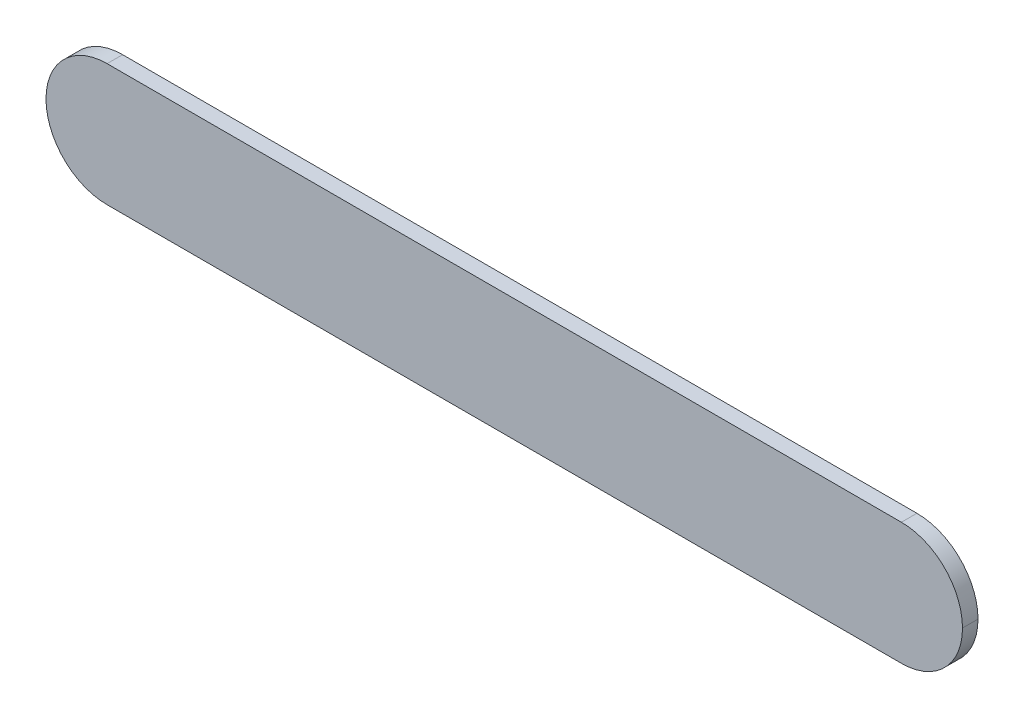
ISO-10303-21;
HEADER;
FILE_DESCRIPTION(('STEP AP214'),'2;1');
FILE_NAME('part.step','',(''),(''),'','','');
FILE_SCHEMA(('AUTOMOTIVE_DESIGN { 1 0 10303 214 1 1 1 1 }'));
ENDSEC;
DATA;
#1=APPLICATION_CONTEXT('core data for automotive mechanical design processes');
#2=APPLICATION_PROTOCOL_DEFINITION('international standard','automotive_design',2000,#1);
#3=PRODUCT_CONTEXT('',#1,'mechanical');
#4=PRODUCT('Part','Part','',(#3));
#5=PRODUCT_RELATED_PRODUCT_CATEGORY('part','',(#4));
#6=PRODUCT_DEFINITION_FORMATION('','',#4);
#7=PRODUCT_DEFINITION_CONTEXT('part definition',#1,'design');
#8=PRODUCT_DEFINITION('design','',#6,#7);
#9=PRODUCT_DEFINITION_SHAPE('','',#8);
#10=(LENGTH_UNIT() NAMED_UNIT(*) SI_UNIT(.MILLI.,.METRE.));
#11=(NAMED_UNIT(*) PLANE_ANGLE_UNIT() SI_UNIT($,.RADIAN.));
#12=(NAMED_UNIT(*) SI_UNIT($,.STERADIAN.) SOLID_ANGLE_UNIT());
#13=UNCERTAINTY_MEASURE_WITH_UNIT(LENGTH_MEASURE(1.E-05),#10,'distance_accuracy_value','');
#14=(GEOMETRIC_REPRESENTATION_CONTEXT(3) GLOBAL_UNCERTAINTY_ASSIGNED_CONTEXT((#13)) GLOBAL_UNIT_ASSIGNED_CONTEXT((#10,
#11,#12)) REPRESENTATION_CONTEXT('',''));
#15=CARTESIAN_POINT('',(0.,0.,0.));
#16=DIRECTION('',(0.,0.,1.));
#17=DIRECTION('',(1.,0.,0.));
#18=AXIS2_PLACEMENT_3D('',#15,#16,#17);
#19=CARTESIAN_POINT('',(12.150100097656,51.886499023437,1.1723000001));
#20=DIRECTION('',(0.,0.,1.));
#21=DIRECTION('',(1.,0.,0.));
#22=AXIS2_PLACEMENT_3D('',#19,#20,#21);
#23=PLANE('',#22);
#24=CARTESIAN_POINT('',(11.825100097656,51.886499023437,1.1723000001));
#25=DIRECTION('',(0.,0.,-1.));
#26=DIRECTION('',(1.,0.,0.));
#27=AXIS2_PLACEMENT_3D('',#24,#25,#26);
#28=CIRCLE('',#27,0.05);
#29=CARTESIAN_POINT('',(11.825100097656,51.836499023438,1.1723000001));
#30=VERTEX_POINT('',#29);
#31=CARTESIAN_POINT('',(11.825100097656,51.936499023437,1.1723000001));
#32=VERTEX_POINT('',#31);
#33=EDGE_CURVE('E112',#30,#32,#28,.T.);
#34=ORIENTED_EDGE('',*,*,#33,.F.);
#35=DIRECTION('',(1.,0.,0.));
#36=VECTOR('',#35,1.);
#37=CARTESIAN_POINT('',(12.475100097656,51.836499023438,1.1723000001));
#38=LINE('',#37,#36);
#39=CARTESIAN_POINT('',(12.475100097656,51.836499023437,1.1723000001));
#40=VERTEX_POINT('',#39);
#41=EDGE_CURVE('E79',#30,#40,#38,.T.);
#42=ORIENTED_EDGE('',*,*,#41,.T.);
#43=CARTESIAN_POINT('',(12.475100097656,51.886499023437,1.1723000001));
#44=DIRECTION('',(0.,0.,-1.));
#45=DIRECTION('',(1.,0.,0.));
#46=AXIS2_PLACEMENT_3D('',#43,#44,#45);
#47=CIRCLE('',#46,0.05);
#48=CARTESIAN_POINT('',(12.525100097656,51.886499023437,1.1723000001));
#49=VERTEX_POINT('',#48);
#50=EDGE_CURVE('E21',#49,#40,#47,.T.);
#51=ORIENTED_EDGE('',*,*,#50,.F.);
#52=CARTESIAN_POINT('',(12.475100097656,51.886499023437,1.1723000001));
#53=DIRECTION('',(0.,0.,-1.));
#54=DIRECTION('',(1.,0.,0.));
#55=AXIS2_PLACEMENT_3D('',#52,#53,#54);
#56=CIRCLE('',#55,0.05);
#57=CARTESIAN_POINT('',(12.475100097656,51.936499023437,1.1723000001));
#58=VERTEX_POINT('',#57);
#59=EDGE_CURVE('E83',#58,#49,#56,.T.);
#60=ORIENTED_EDGE('',*,*,#59,.F.);
#61=DIRECTION('',(-1.,0.,0.));
#62=VECTOR('',#61,1.);
#63=CARTESIAN_POINT('',(11.825100097656,51.936499023437,1.1723000001));
#64=LINE('',#63,#62);
#65=EDGE_CURVE('E11',#58,#32,#64,.T.);
#66=ORIENTED_EDGE('',*,*,#65,.T.);
#67=EDGE_LOOP('',(#34,#42,#51,#60,#66));
#68=FACE_BOUND('',#67,.T.);
#69=ADVANCED_FACE('F17',(#68),#23,.T.);
#70=CARTESIAN_POINT('',(11.825100097656,51.936499023437,1.1596000001));
#71=DIRECTION('',(0.,-1.,0.));
#72=DIRECTION('',(0.,0.,-1.));
#73=AXIS2_PLACEMENT_3D('',#70,#71,#72);
#74=PLANE('',#73);
#75=DIRECTION('',(0.,0.,1.));
#76=VECTOR('',#75,1.);
#77=CARTESIAN_POINT('',(12.475100097656,51.936499023437,1.1596000001));
#78=LINE('',#77,#76);
#79=CARTESIAN_POINT('',(12.475100097656,51.936499023437,1.1596000001));
#80=VERTEX_POINT('',#79);
#81=EDGE_CURVE('E110',#80,#58,#78,.T.);
#82=ORIENTED_EDGE('',*,*,#81,.F.);
#83=DIRECTION('',(-1.,0.,0.));
#84=VECTOR('',#83,1.);
#85=CARTESIAN_POINT('',(12.150100097656,51.936499023437,1.1596000001));
#86=LINE('',#85,#84);
#87=CARTESIAN_POINT('',(11.825100097656,51.936499023437,1.1596000001));
#88=VERTEX_POINT('',#87);
#89=EDGE_CURVE('E92',#80,#88,#86,.T.);
#90=ORIENTED_EDGE('',*,*,#89,.T.);
#91=DIRECTION('',(0.,0.,-1.));
#92=VECTOR('',#91,1.);
#93=CARTESIAN_POINT('',(11.825100097656,51.936499023437,1.1596000001));
#94=LINE('',#93,#92);
#95=EDGE_CURVE('E28',#32,#88,#94,.T.);
#96=ORIENTED_EDGE('',*,*,#95,.F.);
#97=ORIENTED_EDGE('',*,*,#65,.F.);
#98=EDGE_LOOP('',(#82,#90,#96,#97));
#99=FACE_BOUND('',#98,.T.);
#100=ADVANCED_FACE('F136',(#99),#74,.F.);
#101=CARTESIAN_POINT('',(11.825100097656,51.886499023437,1.1596000001));
#102=DIRECTION('',(0.,0.,1.));
#103=DIRECTION('',(1.,0.,0.));
#104=AXIS2_PLACEMENT_3D('',#101,#102,#103);
#105=CYLINDRICAL_SURFACE('',#104,0.05);
#106=CARTESIAN_POINT('',(11.825100097656,51.886499023437,1.1596000001));
#107=DIRECTION('',(0.,0.,1.));
#108=DIRECTION('',(1.,0.,0.));
#109=AXIS2_PLACEMENT_3D('',#106,#107,#108);
#110=CIRCLE('',#109,0.05);
#111=CARTESIAN_POINT('',(11.825100097656,51.836499023438,1.1596000001));
#112=VERTEX_POINT('',#111);
#113=EDGE_CURVE('E86',#88,#112,#110,.T.);
#114=ORIENTED_EDGE('',*,*,#113,.T.);
#115=DIRECTION('',(0.,0.,1.));
#116=VECTOR('',#115,1.);
#117=CARTESIAN_POINT('',(11.825100097656,51.836499023438,1.1596000001));
#118=LINE('',#117,#116);
#119=EDGE_CURVE('E72',#112,#30,#118,.T.);
#120=ORIENTED_EDGE('',*,*,#119,.T.);
#121=ORIENTED_EDGE('',*,*,#33,.T.);
#122=ORIENTED_EDGE('',*,*,#95,.T.);
#123=EDGE_LOOP('',(#114,#120,#121,#122));
#124=FACE_BOUND('',#123,.T.);
#125=ADVANCED_FACE('F87',(#124),#105,.T.);
#126=CARTESIAN_POINT('',(12.475100097656,51.836499023438,1.1596000001));
#127=DIRECTION('',(0.,1.,0.));
#128=DIRECTION('',(1.,0.,0.));
#129=AXIS2_PLACEMENT_3D('',#126,#127,#128);
#130=PLANE('',#129);
#131=ORIENTED_EDGE('',*,*,#119,.F.);
#132=DIRECTION('',(1.,0.,0.));
#133=VECTOR('',#132,1.);
#134=CARTESIAN_POINT('',(12.150100097656,51.836499023438,1.1596000001));
#135=LINE('',#134,#133);
#136=CARTESIAN_POINT('',(12.475100097656,51.836499023437,1.1596000001));
#137=VERTEX_POINT('',#136);
#138=EDGE_CURVE('E77',#112,#137,#135,.T.);
#139=ORIENTED_EDGE('',*,*,#138,.T.);
#140=DIRECTION('',(0.,0.,-1.));
#141=VECTOR('',#140,1.);
#142=CARTESIAN_POINT('',(12.475100097656,51.836499023437,1.1596000001));
#143=LINE('',#142,#141);
#144=EDGE_CURVE('E99',#40,#137,#143,.T.);
#145=ORIENTED_EDGE('',*,*,#144,.F.);
#146=ORIENTED_EDGE('',*,*,#41,.F.);
#147=EDGE_LOOP('',(#131,#139,#145,#146));
#148=FACE_BOUND('',#147,.T.);
#149=ADVANCED_FACE('F74',(#148),#130,.F.);
#150=CARTESIAN_POINT('',(12.475100097656,51.886499023437,1.1596000001));
#151=DIRECTION('',(0.,0.,1.));
#152=DIRECTION('',(1.,0.,0.));
#153=AXIS2_PLACEMENT_3D('',#150,#151,#152);
#154=CYLINDRICAL_SURFACE('',#153,0.05);
#155=DIRECTION('',(0.,0.,1.));
#156=VECTOR('',#155,1.);
#157=CARTESIAN_POINT('',(12.525100097656,51.886499023437,1.1596000001));
#158=LINE('',#157,#156);
#159=CARTESIAN_POINT('',(12.525100097656,51.886499023437,1.1596000001));
#160=VERTEX_POINT('',#159);
#161=EDGE_CURVE('E124',#160,#49,#158,.T.);
#162=ORIENTED_EDGE('',*,*,#161,.F.);
#163=CARTESIAN_POINT('',(12.475100097656,51.886499023437,1.1596000001));
#164=DIRECTION('',(0.,0.,1.));
#165=DIRECTION('',(1.,0.,0.));
#166=AXIS2_PLACEMENT_3D('',#163,#164,#165);
#167=CIRCLE('',#166,0.05);
#168=EDGE_CURVE('E118',#160,#80,#167,.T.);
#169=ORIENTED_EDGE('',*,*,#168,.T.);
#170=ORIENTED_EDGE('',*,*,#81,.T.);
#171=ORIENTED_EDGE('',*,*,#59,.T.);
#172=EDGE_LOOP('',(#162,#169,#170,#171));
#173=FACE_BOUND('',#172,.T.);
#174=ADVANCED_FACE('F19',(#173),#154,.T.);
#175=CARTESIAN_POINT('',(12.150100097656,51.886499023437,1.1596000001));
#176=DIRECTION('',(0.,0.,1.));
#177=DIRECTION('',(1.,0.,0.));
#178=AXIS2_PLACEMENT_3D('',#175,#176,#177);
#179=PLANE('',#178);
#180=ORIENTED_EDGE('',*,*,#138,.F.);
#181=ORIENTED_EDGE('',*,*,#113,.F.);
#182=ORIENTED_EDGE('',*,*,#89,.F.);
#183=ORIENTED_EDGE('',*,*,#168,.F.);
#184=CARTESIAN_POINT('',(12.475100097656,51.886499023437,1.1596000001));
#185=DIRECTION('',(0.,0.,1.));
#186=DIRECTION('',(1.,0.,0.));
#187=AXIS2_PLACEMENT_3D('',#184,#185,#186);
#188=CIRCLE('',#187,0.05);
#189=EDGE_CURVE('E97',#137,#160,#188,.T.);
#190=ORIENTED_EDGE('',*,*,#189,.F.);
#191=EDGE_LOOP('',(#180,#181,#182,#183,#190));
#192=FACE_BOUND('',#191,.T.);
#193=ADVANCED_FACE('F95',(#192),#179,.F.);
#194=CARTESIAN_POINT('',(12.475100097656,51.886499023437,1.1596000001));
#195=DIRECTION('',(0.,0.,1.));
#196=DIRECTION('',(1.,0.,0.));
#197=AXIS2_PLACEMENT_3D('',#194,#195,#196);
#198=CYLINDRICAL_SURFACE('',#197,0.05);
#199=ORIENTED_EDGE('',*,*,#189,.T.);
#200=ORIENTED_EDGE('',*,*,#161,.T.);
#201=ORIENTED_EDGE('',*,*,#50,.T.);
#202=ORIENTED_EDGE('',*,*,#144,.T.);
#203=EDGE_LOOP('',(#199,#200,#201,#202));
#204=FACE_BOUND('',#203,.T.);
#205=ADVANCED_FACE('F151',(#204),#198,.T.);
#206=CLOSED_SHELL('',(#69,#100,#125,#149,#174,#193,#205));
#207=MANIFOLD_SOLID_BREP('B1',#206);
#208=ADVANCED_BREP_SHAPE_REPRESENTATION('',(#18,#207),#14);
#209=SHAPE_DEFINITION_REPRESENTATION(#9,#208);
ENDSEC;
END-ISO-10303-21;
